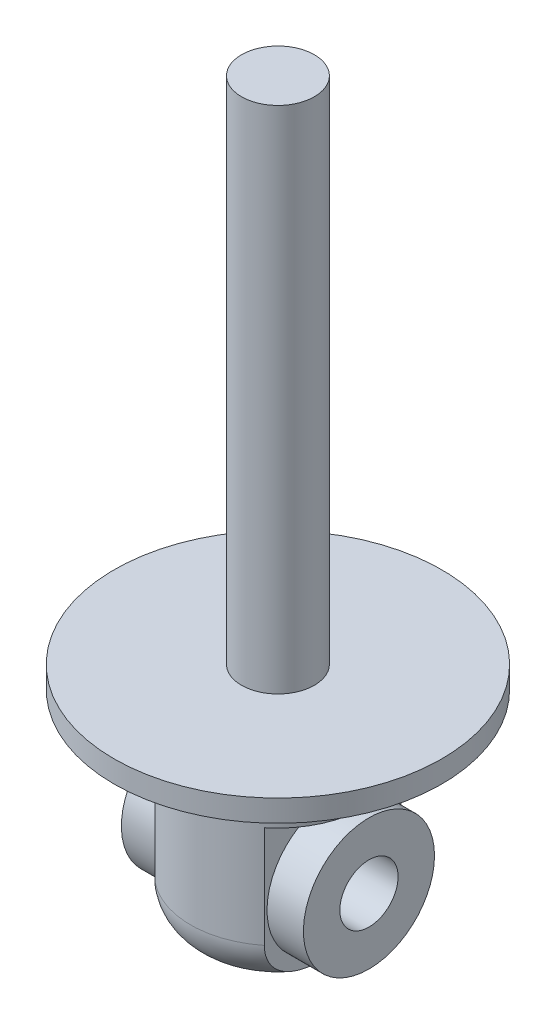
ISO-10303-21;
HEADER;
FILE_DESCRIPTION(('STEP AP214'),'2;1');
FILE_NAME('part.step','',(''),(''),'','','');
FILE_SCHEMA(('AUTOMOTIVE_DESIGN { 1 0 10303 214 1 1 1 1 }'));
ENDSEC;
DATA;
#1=APPLICATION_CONTEXT('core data for automotive mechanical design processes');
#2=APPLICATION_PROTOCOL_DEFINITION('international standard','automotive_design',2000,#1);
#3=PRODUCT_CONTEXT('',#1,'mechanical');
#4=PRODUCT('Part','Part','',(#3));
#5=PRODUCT_RELATED_PRODUCT_CATEGORY('part','',(#4));
#6=PRODUCT_DEFINITION_FORMATION('','',#4);
#7=PRODUCT_DEFINITION_CONTEXT('part definition',#1,'design');
#8=PRODUCT_DEFINITION('design','',#6,#7);
#9=PRODUCT_DEFINITION_SHAPE('','',#8);
#10=(LENGTH_UNIT() NAMED_UNIT(*) SI_UNIT(.MILLI.,.METRE.));
#11=(NAMED_UNIT(*) PLANE_ANGLE_UNIT() SI_UNIT($,.RADIAN.));
#12=(NAMED_UNIT(*) SI_UNIT($,.STERADIAN.) SOLID_ANGLE_UNIT());
#13=UNCERTAINTY_MEASURE_WITH_UNIT(LENGTH_MEASURE(1.E-05),#10,'distance_accuracy_value','');
#14=(GEOMETRIC_REPRESENTATION_CONTEXT(3) GLOBAL_UNCERTAINTY_ASSIGNED_CONTEXT((#13)) GLOBAL_UNIT_ASSIGNED_CONTEXT((#10,
#11,#12)) REPRESENTATION_CONTEXT('',''));
#15=CARTESIAN_POINT('',(0.,0.,0.));
#16=DIRECTION('',(0.,0.,1.));
#17=DIRECTION('',(1.,0.,0.));
#18=AXIS2_PLACEMENT_3D('',#15,#16,#17);
#19=CARTESIAN_POINT('',(-7.5,-8.,-22.5));
#20=DIRECTION('',(1.,0.,0.));
#21=DIRECTION('',(0.,1.,0.));
#22=AXIS2_PLACEMENT_3D('',#19,#20,#21);
#23=PLANE('',#22);
#24=CARTESIAN_POINT('',(-7.5,-27.8094750193111,0.));
#25=CARTESIAN_POINT('',(-7.5,-27.8094752958151,0.184521628242419));
#26=CARTESIAN_POINT('',(-7.5,-27.8077270322999,0.369043480287191));
#27=CARTESIAN_POINT('',(-7.5,-27.8006130628877,0.737999394292284));
#28=CARTESIAN_POINT('',(-7.5,-27.7952477367066,0.922433463434384));
#29=CARTESIAN_POINT('',(-7.5,-27.780538513706,1.29122559425462));
#30=CARTESIAN_POINT('',(-7.5,-27.7711929215574,1.47558358999919));
#31=CARTESIAN_POINT('',(-7.5,-27.7479507640883,1.84401846668315));
#32=CARTESIAN_POINT('',(-7.5,-27.734054140347,2.02809534398339));
#33=CARTESIAN_POINT('',(-7.5,-27.701027325669,2.39498843631837));
#34=CARTESIAN_POINT('',(-7.5,-27.6819201299087,2.57780665418326));
#35=CARTESIAN_POINT('',(-7.5,-27.6375682217561,2.94269408038083));
#36=CARTESIAN_POINT('',(-7.5,-27.6123230495969,3.12476323156505));
#37=CARTESIAN_POINT('',(-7.5,-27.5259360262262,3.6691632505479));
#38=CARTESIAN_POINT('',(-7.5,-27.4541196223952,4.02997739530099));
#39=CARTESIAN_POINT('',(-7.5,-27.315114172541,4.57935988961709));
#40=CARTESIAN_POINT('',(-7.5,-27.2608348848703,4.77122256452969));
#41=CARTESIAN_POINT('',(-7.5,-27.1402411036094,5.15109529504942));
#42=CARTESIAN_POINT('',(-7.5,-27.0739312594077,5.33910680786539));
#43=CARTESIAN_POINT('',(-7.5,-26.928148698992,5.70992505463463));
#44=CARTESIAN_POINT('',(-7.5,-26.8486797977089,5.8927332791208));
#45=CARTESIAN_POINT('',(-7.5,-26.6756224712841,6.25155879665883));
#46=CARTESIAN_POINT('',(-7.5,-26.5820364486502,6.42757723883459));
#47=CARTESIAN_POINT('',(-7.5,-26.3958384208508,6.74413785402998));
#48=CARTESIAN_POINT('',(-7.5,-26.3053527427416,6.8859302136676));
#49=CARTESIAN_POINT('',(-7.5,-26.1136422044668,7.16205254122039));
#50=CARTESIAN_POINT('',(-7.5,-26.0124194056704,7.29638393401336));
#51=CARTESIAN_POINT('',(-7.5,-25.7991822855038,7.55627452274061));
#52=CARTESIAN_POINT('',(-7.5,-25.6871652583255,7.6818315054992));
#53=CARTESIAN_POINT('',(-7.5,-25.4525813942248,7.92270374400352));
#54=CARTESIAN_POINT('',(-7.5,-25.3300144777409,8.03801892249803));
#55=CARTESIAN_POINT('',(-7.5,-25.0736714823962,8.25792234562975));
#56=CARTESIAN_POINT('',(-7.5,-24.9398051473305,8.36240569865935));
#57=CARTESIAN_POINT('',(-7.5,-24.662616920615,8.55796576900282));
#58=CARTESIAN_POINT('',(-7.5,-24.5192963548439,8.64904436046083));
#59=CARTESIAN_POINT('',(-7.5,-24.2243409104845,8.81636481076627));
#60=CARTESIAN_POINT('',(-7.5,-24.0727112205184,8.89261579636784));
#61=CARTESIAN_POINT('',(-7.5,-23.7624095052739,9.02909243430965));
#62=CARTESIAN_POINT('',(-7.5,-23.6037388369551,9.08932115899453));
#63=CARTESIAN_POINT('',(-7.5,-23.3052245459151,9.1849514334904));
#64=CARTESIAN_POINT('',(-7.5,-23.1661361294911,9.22272405795734));
#65=CARTESIAN_POINT('',(-7.5,-22.8851087613884,9.28547940350164));
#66=CARTESIAN_POINT('',(-7.5,-22.7431701638949,9.31046370365637));
#67=CARTESIAN_POINT('',(-7.5,-22.4576599589478,9.34730641699016));
#68=CARTESIAN_POINT('',(-7.5,-22.3140890586128,9.35917031033292));
#69=CARTESIAN_POINT('',(-7.5,-22.0264648581988,9.36963164548865));
#70=CARTESIAN_POINT('',(-7.5,-21.8824115750842,9.36822954903948));
#71=CARTESIAN_POINT('',(-7.5,-21.6061914815275,9.35280339576898));
#72=CARTESIAN_POINT('',(-7.5,-21.4739684759154,9.33976569953801));
#73=CARTESIAN_POINT('',(-7.5,-21.2110534946456,9.30256363878721));
#74=CARTESIAN_POINT('',(-7.5,-21.0803620180608,9.27839574533066));
#75=CARTESIAN_POINT('',(-7.5,-20.8215410609612,9.21922065645586));
#76=CARTESIAN_POINT('',(-7.5,-20.6934101253726,9.18421981495561));
#77=CARTESIAN_POINT('',(-7.5,-20.4404340442512,9.10374552536161));
#78=CARTESIAN_POINT('',(-7.5,-20.3155901493276,9.05826815366643));
#79=CARTESIAN_POINT('',(-7.5,-20.0692031015505,8.95699564520569));
#80=CARTESIAN_POINT('',(-7.5,-19.9476868658852,8.90113499399755));
#81=CARTESIAN_POINT('',(-7.5,-19.7094920695403,8.77987692751896));
#82=CARTESIAN_POINT('',(-7.5,-19.5928152563103,8.71447610526943));
#83=CARTESIAN_POINT('',(-7.5,-19.2509911073174,8.50489875856372));
#84=CARTESIAN_POINT('',(-7.5,-19.0339195251877,8.34729299116935));
#85=CARTESIAN_POINT('',(-7.5,-18.609337427954,7.98870608163153));
#86=CARTESIAN_POINT('',(-7.5,-18.4039002281567,7.78529755950602));
#87=CARTESIAN_POINT('',(-7.5,-18.0246758733926,7.35109040646743));
#88=CARTESIAN_POINT('',(-7.5,-17.8508837047537,7.12029612399675));
#89=CARTESIAN_POINT('',(-7.5,-17.5744409595824,6.69864287979116));
#90=CARTESIAN_POINT('',(-7.5,-17.4648689537028,6.51223410047274));
#91=CARTESIAN_POINT('',(-7.5,-17.2626904112623,6.13034538679087));
#92=CARTESIAN_POINT('',(-7.5,-17.1700919878543,5.93486117014359));
#93=CARTESIAN_POINT('',(-7.5,-17.0006313082269,5.53658641063458));
#94=CARTESIAN_POINT('',(-7.5,-16.9238147555949,5.33377659321381));
#95=CARTESIAN_POINT('',(-7.5,-16.784875362625,4.92331428460811));
#96=CARTESIAN_POINT('',(-7.5,-16.7227484430634,4.71566315546475));
#97=CARTESIAN_POINT('',(-7.5,-16.5386673542946,4.02250667384636));
#98=CARTESIAN_POINT('',(-7.5,-16.4449803111871,3.52942656369883));
#99=CARTESIAN_POINT('',(-7.5,-16.3412352530644,2.78498720051468));
#100=CARTESIAN_POINT('',(-7.5,-16.3127705467372,2.53568557770052));
#101=CARTESIAN_POINT('',(-7.5,-16.2658269581612,2.03612434937441));
#102=CARTESIAN_POINT('',(-7.5,-16.2473468655649,1.78586486368144));
#103=CARTESIAN_POINT('',(-7.5,-16.2184283009414,1.28363112408655));
#104=CARTESIAN_POINT('',(-7.5,-16.208031590786,1.03165466176094));
#105=CARTESIAN_POINT('',(-7.5,-16.1941849220444,0.527501194688707));
#106=CARTESIAN_POINT('',(-7.5,-16.1907352988047,0.27532418084894));
#107=CARTESIAN_POINT('',(-7.5,-16.1903333462322,-0.228731345602945));
#108=CARTESIAN_POINT('',(-7.5,-16.193373232494,-0.480609853630143));
#109=CARTESIAN_POINT('',(-7.5,-16.2063332691715,-0.984173581494234));
#110=CARTESIAN_POINT('',(-7.5,-16.2162528039696,-1.2358588166087));
#111=CARTESIAN_POINT('',(-7.5,-16.2454935008677,-1.7627882566893));
#112=CARTESIAN_POINT('',(-7.5,-16.2656211327378,-2.03798990109168));
#113=CARTESIAN_POINT('',(-7.5,-16.3180418431017,-2.58731345976836));
#114=CARTESIAN_POINT('',(-7.5,-16.3503365349836,-2.86143522597441));
#115=CARTESIAN_POINT('',(-7.5,-16.4300545548583,-3.40623279358435));
#116=CARTESIAN_POINT('',(-7.5,-16.4774071358833,-3.67691867401872));
#117=CARTESIAN_POINT('',(-7.5,-16.5907053400646,-4.2143947607995));
#118=CARTESIAN_POINT('',(-7.5,-16.6566449229111,-4.4811862031647));
#119=CARTESIAN_POINT('',(-7.5,-16.7911834026755,-4.94217748017442));
#120=CARTESIAN_POINT('',(-7.5,-16.8549558474619,-5.13778160857807));
#121=CARTESIAN_POINT('',(-7.5,-16.9961265709521,-5.52399422741739));
#122=CARTESIAN_POINT('',(-7.5,-17.0735207892669,-5.71460418712136));
#123=CARTESIAN_POINT('',(-7.5,-17.2430793617625,-6.08921987221889));
#124=CARTESIAN_POINT('',(-7.5,-17.3352463319138,-6.27322442084438));
#125=CARTESIAN_POINT('',(-7.5,-17.5351759469553,-6.63256976145457));
#126=CARTESIAN_POINT('',(-7.5,-17.6429345063483,-6.80791280693597));
#127=CARTESIAN_POINT('',(-7.5,-17.8487615005736,-7.10989658300673));
#128=CARTESIAN_POINT('',(-7.5,-17.9436617626469,-7.23870103997639));
#129=CARTESIAN_POINT('',(-7.5,-18.143229826346,-7.48856622066219));
#130=CARTESIAN_POINT('',(-7.5,-18.2478987883735,-7.60962602152204));
#131=CARTESIAN_POINT('',(-7.5,-18.4668045949393,-7.84271387792474));
#132=CARTESIAN_POINT('',(-7.5,-18.5810384459287,-7.95474473789612));
#133=CARTESIAN_POINT('',(-7.5,-18.8187268203134,-8.16854933672494));
#134=CARTESIAN_POINT('',(-7.5,-18.9421800591116,-8.27032449994957));
#135=CARTESIAN_POINT('',(-7.5,-19.1987356397018,-8.46313596223061));
#136=CARTESIAN_POINT('',(-7.5,-19.3319055781875,-8.55408255407202));
#137=CARTESIAN_POINT('',(-7.5,-19.6061418402457,-8.72304401015934));
#138=CARTESIAN_POINT('',(-7.5,-19.747204378254,-8.80106500403696));
#139=CARTESIAN_POINT('',(-7.5,-20.0362068877473,-8.94309470867639));
#140=CARTESIAN_POINT('',(-7.5,-20.1841460034049,-9.00710515749598));
#141=CARTESIAN_POINT('',(-7.5,-20.4856380297523,-9.12014361193693));
#142=CARTESIAN_POINT('',(-7.5,-20.6391901444676,-9.16917373274798));
#143=CARTESIAN_POINT('',(-7.5,-20.9313639562727,-9.24643392787081));
#144=CARTESIAN_POINT('',(-7.5,-21.0695088202567,-9.2764768563288));
#145=CARTESIAN_POINT('',(-7.5,-21.3479315795213,-9.32406143536891));
#146=CARTESIAN_POINT('',(-7.5,-21.4882092809527,-9.34160421520928));
#147=CARTESIAN_POINT('',(-7.5,-21.769719609589,-9.36396002322678));
#148=CARTESIAN_POINT('',(-7.5,-21.9109518422674,-9.36877802253041));
#149=CARTESIAN_POINT('',(-7.5,-22.1932734390957,-9.36563613906261));
#150=CARTESIAN_POINT('',(-7.5,-22.3343628067459,-9.35767657732182));
#151=CARTESIAN_POINT('',(-7.5,-22.6064011749062,-9.32998563551062));
#152=CARTESIAN_POINT('',(-7.5,-22.7374295539783,-9.31102660205279));
#153=CARTESIAN_POINT('',(-7.5,-22.9974780227225,-9.26218788836622));
#154=CARTESIAN_POINT('',(-7.5,-23.1264974548056,-9.23230470755187));
#155=CARTESIAN_POINT('',(-7.5,-23.3815508516768,-9.16196479385525));
#156=CARTESIAN_POINT('',(-7.5,-23.5075862018084,-9.12151307666088));
#157=CARTESIAN_POINT('',(-7.5,-23.7559772755244,-9.03044888037393));
#158=CARTESIAN_POINT('',(-7.5,-23.8783315975104,-8.97983258590814));
#159=CARTESIAN_POINT('',(-7.5,-24.1205569584555,-8.8680617574251));
#160=CARTESIAN_POINT('',(-7.5,-24.2403549182387,-8.80674877020291));
#161=CARTESIAN_POINT('',(-7.5,-24.4747211723639,-8.67480187441993));
#162=CARTESIAN_POINT('',(-7.5,-24.5892875713423,-8.60416462323317));
#163=CARTESIAN_POINT('',(-7.5,-24.9242270275788,-8.37928997825773));
#164=CARTESIAN_POINT('',(-7.5,-25.13600210755,-8.21201407264852));
#165=CARTESIAN_POINT('',(-7.5,-25.5504485361803,-7.832942739178));
#166=CARTESIAN_POINT('',(-7.5,-25.7507010772538,-7.618532285847));
#167=CARTESIAN_POINT('',(-7.5,-26.1185076671662,-7.16337882817299));
#168=CARTESIAN_POINT('',(-7.5,-26.2860513710234,-6.9226275303298));
#169=CARTESIAN_POINT('',(-7.5,-26.5545024709803,-6.4788664395953));
#170=CARTESIAN_POINT('',(-7.5,-26.6619013252763,-6.279707295078));
#171=CARTESIAN_POINT('',(-7.5,-26.858559219587,-5.87254463104013));
#172=CARTESIAN_POINT('',(-7.5,-26.9478095430477,-5.66453691936402));
#173=CARTESIAN_POINT('',(-7.5,-27.1096214973705,-5.24180758530233));
#174=CARTESIAN_POINT('',(-7.5,-27.1821555960046,-5.02707553901332));
#175=CARTESIAN_POINT('',(-7.5,-27.3121001369762,-4.59305326757356));
#176=CARTESIAN_POINT('',(-7.5,-27.3695048137837,-4.37376133898657));
#177=CARTESIAN_POINT('',(-7.5,-27.4981886749365,-3.81417726059937));
#178=CARTESIAN_POINT('',(-7.5,-27.5604951716191,-3.47183296905169));
#179=CARTESIAN_POINT('',(-7.5,-27.6609019684328,-2.78359200614869));
#180=CARTESIAN_POINT('',(-7.5,-27.6989863972919,-2.43769315620305));
#181=CARTESIAN_POINT('',(-7.5,-27.7425563308733,-1.91723181279188));
#182=CARTESIAN_POINT('',(-7.5,-27.7548291128016,-1.74318957751326));
#183=CARTESIAN_POINT('',(-7.5,-27.7753986995787,-1.39487161182967));
#184=CARTESIAN_POINT('',(-7.5,-27.7836956019396,-1.22059588725638));
#185=CARTESIAN_POINT('',(-7.5,-27.796777523185,-0.87196539298604));
#186=CARTESIAN_POINT('',(-7.5,-27.8015635129394,-0.697610658492171));
#187=CARTESIAN_POINT('',(-7.5,-27.8079121855994,-0.348837350643893));
#188=CARTESIAN_POINT('',(-7.5,-27.8094747579462,-0.174418775305038));
#189=CARTESIAN_POINT('',(-7.5,-27.8094750193111,0.));
#190=B_SPLINE_CURVE_WITH_KNOTS('',3,(#24,#25,#26,#27,#28,#29,#30,#31,#32,#33,#34,#35,#36,#37,
#38,#39,#40,#41,#42,#43,#44,#45,#46,#47,#48,#49,#50,#51,#52,#53,#54,#55,#56,#57,#58,#59,#60,#61,
#62,#63,#64,#65,#66,#67,#68,#69,#70,#71,#72,#73,#74,#75,#76,#77,#78,#79,#80,#81,#82,#83,#84,#85,
#86,#87,#88,#89,#90,#91,#92,#93,#94,#95,#96,#97,#98,#99,#100,#101,#102,#103,#104,#105,#106,#107,
#108,#109,#110,#111,#112,#113,#114,#115,#116,#117,#118,#119,#120,#121,#122,#123,#124,#125,#126,
#127,#128,#129,#130,#131,#132,#133,#134,#135,#136,#137,#138,#139,#140,#141,#142,#143,#144,#145,
#146,#147,#148,#149,#150,#151,#152,#153,#154,#155,#156,#157,#158,#159,#160,#161,#162,#163,#164,
#165,#166,#167,#168,#169,#170,#171,#172,#173,#174,#175,#176,#177,#178,#179,#180,#181,#182,#183,
#184,#185,#186,#187,#188,#189),.UNSPECIFIED.,.T.,.F.,(4,2,2,2,2,2,2,2,2,2,2,2,2,2,2,2,2,2,2,2,2,
2,2,2,2,2,2,2,2,2,2,2,2,2,2,2,2,2,2,2,2,2,2,2,2,2,2,2,2,2,2,2,2,2,2,2,2,2,2,2,2,2,2,2,2,2,2,2,2,
2,2,2,2,2,2,2,2,2,2,2,2,2,4),(0.,0.553556541747908,1.10705498067111,1.6607894093517,
2.21453094651203,2.76586720349669,3.31724477121585,4.41912680182766,5.01698525599297,
5.61461314908642,6.21206808675634,6.80942146164093,7.31357153503217,7.81762499361292,
8.32180513447661,8.82598907791493,9.33467160980088,9.84328295415676,10.3515802378956,
10.8597799828438,11.291588037567,11.7233427606026,12.1549170790764,12.5864763761706,
12.9845986570771,13.3828472534997,13.7808627038906,14.1790274594521,14.579795450788,
14.9807069160888,15.7821103743006,16.6461503316802,17.5100532757815,18.1578732554314,
18.8060020817716,19.4559821948788,20.1057815998326,21.6069748462105,22.3596793389022,
23.1122925673175,23.8687687149109,24.6252813779039,25.3808870860738,26.1364251884592,
26.9640249034877,27.7917343993232,28.6156111127982,29.4392203950451,30.0559954213971,
30.6725869093732,31.2892877047367,31.9058271963482,32.3853559200308,32.8649416785199,
33.3443778968313,33.823747436381,34.3068464150843,34.7897156366604,35.2725249226045,
35.7552660053908,36.1788379642465,36.6023716529343,37.0257398573389,37.4490974249689,
37.8458122806135,38.2426543730445,38.639308470493,39.0361117351622,39.4393886143668,
39.8428104576492,40.6491243408277,41.5260051520067,42.403162850804,43.0810551134699,
43.7592721958252,44.4385984678268,45.1181832448309,46.1608437011148,47.2041866484774,
47.7275747628343,48.2509500399341,48.7741805338585,49.2974289735857),.UNSPECIFIED.);
#191=CARTESIAN_POINT('',(-7.5,-22.,-9.3674969975976));
#192=VERTEX_POINT('',#191);
#193=CARTESIAN_POINT('',(-7.5,-21.9999999999999,9.36749699759766));
#194=VERTEX_POINT('',#193);
#195=EDGE_CURVE('E128',#192,#194,#190,.T.);
#196=ORIENTED_EDGE('',*,*,#195,.T.);
#197=DIRECTION('',(0.,1.,0.));
#198=VECTOR('',#197,1.);
#199=CARTESIAN_POINT('',(-7.49999999999999,-28.,9.3674969975976));
#200=LINE('',#199,#198);
#201=CARTESIAN_POINT('',(-7.5,-8.,9.36749699759759));
#202=VERTEX_POINT('',#201);
#203=EDGE_CURVE('E91',#202,#194,#200,.F.);
#204=ORIENTED_EDGE('',*,*,#203,.F.);
#205=DIRECTION('',(0.,0.,1.));
#206=VECTOR('',#205,1.);
#207=CARTESIAN_POINT('',(-7.5,-8.,-22.5));
#208=LINE('',#207,#206);
#209=CARTESIAN_POINT('',(-7.5,-8.,-9.36749699759761));
#210=VERTEX_POINT('',#209);
#211=EDGE_CURVE('E84',#210,#202,#208,.T.);
#212=ORIENTED_EDGE('',*,*,#211,.F.);
#213=DIRECTION('',(0.,1.,0.));
#214=VECTOR('',#213,1.);
#215=CARTESIAN_POINT('',(-7.49999999999999,-28.,-9.3674969975976));
#216=LINE('',#215,#214);
#217=EDGE_CURVE('E62',#192,#210,#216,.T.);
#218=ORIENTED_EDGE('',*,*,#217,.F.);
#219=EDGE_LOOP('',(#196,#204,#212,#218));
#220=FACE_BOUND('',#219,.T.);
#221=CARTESIAN_POINT('',(-7.5,-18.,0.));
#222=DIRECTION('',(1.,0.,0.));
#223=DIRECTION('',(0.,1.,0.));
#224=AXIS2_PLACEMENT_3D('',#221,#222,#223);
#225=CIRCLE('',#224,9.);
#226=CARTESIAN_POINT('',(-7.5,-9.,0.));
#227=VERTEX_POINT('',#226);
#228=EDGE_CURVE('E11',#227,#227,#225,.F.);
#229=ORIENTED_EDGE('',*,*,#228,.F.);
#230=EDGE_LOOP('',(#229));
#231=FACE_BOUND('',#230,.T.);
#232=ADVANCED_FACE('F37',(#220,#231),#23,.F.);
#233=CARTESIAN_POINT('',(7.5,-8.,-22.5));
#234=DIRECTION('',(-1.,0.,0.));
#235=DIRECTION('',(0.,-1.,0.));
#236=AXIS2_PLACEMENT_3D('',#233,#234,#235);
#237=PLANE('',#236);
#238=CARTESIAN_POINT('',(7.5,-27.8094750193111,0.));
#239=CARTESIAN_POINT('',(7.5,-27.8094752958151,-0.18452162824242));
#240=CARTESIAN_POINT('',(7.5,-27.8077270322999,-0.369043480287192));
#241=CARTESIAN_POINT('',(7.5,-27.8006130628877,-0.737999394292286));
#242=CARTESIAN_POINT('',(7.5,-27.7952477367066,-0.922433463434386));
#243=CARTESIAN_POINT('',(7.5,-27.780538513706,-1.29122559425462));
#244=CARTESIAN_POINT('',(7.5,-27.7711929215574,-1.47558358999919));
#245=CARTESIAN_POINT('',(7.5,-27.7479507640883,-1.84401846668315));
#246=CARTESIAN_POINT('',(7.5,-27.734054140347,-2.0280953439834));
#247=CARTESIAN_POINT('',(7.5,-27.701027325669,-2.39498843631837));
#248=CARTESIAN_POINT('',(7.5,-27.6819201299087,-2.57780665418327));
#249=CARTESIAN_POINT('',(7.5,-27.6375682217561,-2.94269408038084));
#250=CARTESIAN_POINT('',(7.5,-27.6123230495969,-3.12476323156505));
#251=CARTESIAN_POINT('',(7.5,-27.5259360262262,-3.6691632505479));
#252=CARTESIAN_POINT('',(7.5,-27.4541196223952,-4.029977395301));
#253=CARTESIAN_POINT('',(7.5,-27.315114172541,-4.57935988961709));
#254=CARTESIAN_POINT('',(7.5,-27.2608348848703,-4.7712225645297));
#255=CARTESIAN_POINT('',(7.5,-27.1402411036094,-5.15109529504943));
#256=CARTESIAN_POINT('',(7.5,-27.0739312594077,-5.3391068078654));
#257=CARTESIAN_POINT('',(7.5,-26.9281486989919,-5.70992505463464));
#258=CARTESIAN_POINT('',(7.5,-26.8486797977089,-5.8927332791208));
#259=CARTESIAN_POINT('',(7.5,-26.6756224712841,-6.25155879665883));
#260=CARTESIAN_POINT('',(7.5,-26.5820364486501,-6.4275772388346));
#261=CARTESIAN_POINT('',(7.5,-26.3958384208508,-6.74413785402998));
#262=CARTESIAN_POINT('',(7.5,-26.3053527427416,-6.8859302136676));
#263=CARTESIAN_POINT('',(7.5,-26.1136422044668,-7.16205254122039));
#264=CARTESIAN_POINT('',(7.5,-26.0124194056704,-7.29638393401336));
#265=CARTESIAN_POINT('',(7.5,-25.7991822855038,-7.55627452274061));
#266=CARTESIAN_POINT('',(7.5,-25.6871652583255,-7.6818315054992));
#267=CARTESIAN_POINT('',(7.5,-25.4525813942248,-7.92270374400352));
#268=CARTESIAN_POINT('',(7.5,-25.3300144777409,-8.03801892249802));
#269=CARTESIAN_POINT('',(7.5,-25.0736714823962,-8.25792234562975));
#270=CARTESIAN_POINT('',(7.5,-24.9398051473305,-8.36240569865935));
#271=CARTESIAN_POINT('',(7.5,-24.662616920615,-8.55796576900281));
#272=CARTESIAN_POINT('',(7.5,-24.5192963548439,-8.64904436046082));
#273=CARTESIAN_POINT('',(7.5,-24.2243409104845,-8.81636481076626));
#274=CARTESIAN_POINT('',(7.5,-24.0727112205184,-8.89261579636783));
#275=CARTESIAN_POINT('',(7.5,-23.7624095052739,-9.02909243430965));
#276=CARTESIAN_POINT('',(7.5,-23.6037388369551,-9.08932115899453));
#277=CARTESIAN_POINT('',(7.5,-23.3052245459151,-9.1849514334904));
#278=CARTESIAN_POINT('',(7.5,-23.1661361294911,-9.22272405795733));
#279=CARTESIAN_POINT('',(7.5,-22.8851087613884,-9.28547940350163));
#280=CARTESIAN_POINT('',(7.5,-22.7431701638949,-9.31046370365637));
#281=CARTESIAN_POINT('',(7.5,-22.4576599589478,-9.34730641699015));
#282=CARTESIAN_POINT('',(7.5,-22.3140890586128,-9.35917031033292));
#283=CARTESIAN_POINT('',(7.5,-22.0264648581988,-9.36963164548865));
#284=CARTESIAN_POINT('',(7.5,-21.8824115750842,-9.36822954903947));
#285=CARTESIAN_POINT('',(7.5,-21.6061914815275,-9.35280339576898));
#286=CARTESIAN_POINT('',(7.5,-21.4739684759153,-9.33976569953801));
#287=CARTESIAN_POINT('',(7.5,-21.2110534946456,-9.3025636387872));
#288=CARTESIAN_POINT('',(7.5,-21.0803620180608,-9.27839574533065));
#289=CARTESIAN_POINT('',(7.5,-20.8215410609612,-9.21922065645586));
#290=CARTESIAN_POINT('',(7.5,-20.6934101253726,-9.1842198149556));
#291=CARTESIAN_POINT('',(7.5,-20.4404340442512,-9.1037455253616));
#292=CARTESIAN_POINT('',(7.5,-20.3155901493276,-9.05826815366643));
#293=CARTESIAN_POINT('',(7.5,-20.0692031015505,-8.95699564520569));
#294=CARTESIAN_POINT('',(7.5,-19.9476868658852,-8.90113499399755));
#295=CARTESIAN_POINT('',(7.5,-19.7094920695403,-8.77987692751896));
#296=CARTESIAN_POINT('',(7.5,-19.5928152563103,-8.71447610526943));
#297=CARTESIAN_POINT('',(7.5,-19.2509911073174,-8.50489875856371));
#298=CARTESIAN_POINT('',(7.5,-19.0339195251877,-8.34729299116934));
#299=CARTESIAN_POINT('',(7.5,-18.609337427954,-7.98870608163152));
#300=CARTESIAN_POINT('',(7.5,-18.4039002281567,-7.78529755950601));
#301=CARTESIAN_POINT('',(7.5,-18.0246758733926,-7.35109040646742));
#302=CARTESIAN_POINT('',(7.5,-17.8508837047537,-7.12029612399674));
#303=CARTESIAN_POINT('',(7.5,-17.5744409595824,-6.69864287979115));
#304=CARTESIAN_POINT('',(7.5,-17.4648689537028,-6.51223410047273));
#305=CARTESIAN_POINT('',(7.5,-17.2626904112623,-6.13034538679086));
#306=CARTESIAN_POINT('',(7.5,-17.1700919878543,-5.93486117014358));
#307=CARTESIAN_POINT('',(7.5,-17.0006313082269,-5.53658641063457));
#308=CARTESIAN_POINT('',(7.5,-16.9238147555949,-5.3337765932138));
#309=CARTESIAN_POINT('',(7.5,-16.784875362625,-4.9233142846081));
#310=CARTESIAN_POINT('',(7.5,-16.7227484430634,-4.71566315546474));
#311=CARTESIAN_POINT('',(7.5,-16.5386673542946,-4.02250667384636));
#312=CARTESIAN_POINT('',(7.5,-16.4449803111871,-3.52942656369882));
#313=CARTESIAN_POINT('',(7.5,-16.3412352530644,-2.78498720051467));
#314=CARTESIAN_POINT('',(7.5,-16.3127705467372,-2.53568557770051));
#315=CARTESIAN_POINT('',(7.5,-16.2658269581612,-2.0361243493744));
#316=CARTESIAN_POINT('',(7.5,-16.2473468655649,-1.78586486368143));
#317=CARTESIAN_POINT('',(7.5,-16.2184283009414,-1.28363112408654));
#318=CARTESIAN_POINT('',(7.5,-16.208031590786,-1.03165466176093));
#319=CARTESIAN_POINT('',(7.5,-16.1941849220444,-0.5275011946887));
#320=CARTESIAN_POINT('',(7.5,-16.1907352988047,-0.275324180848932));
#321=CARTESIAN_POINT('',(7.5,-16.1903333462322,0.228731345602954));
#322=CARTESIAN_POINT('',(7.5,-16.193373232494,0.480609853630152));
#323=CARTESIAN_POINT('',(7.5,-16.2063332691715,0.984173581494243));
#324=CARTESIAN_POINT('',(7.5,-16.2162528039696,1.23585881660871));
#325=CARTESIAN_POINT('',(7.5,-16.2454935008677,1.76278825668931));
#326=CARTESIAN_POINT('',(7.5,-16.2656211327378,2.03798990109169));
#327=CARTESIAN_POINT('',(7.5,-16.3180418431017,2.58731345976837));
#328=CARTESIAN_POINT('',(7.5,-16.3503365349836,2.86143522597442));
#329=CARTESIAN_POINT('',(7.5,-16.4300545548583,3.40623279358436));
#330=CARTESIAN_POINT('',(7.5,-16.4774071358833,3.67691867401872));
#331=CARTESIAN_POINT('',(7.5,-16.5907053400646,4.21439476079951));
#332=CARTESIAN_POINT('',(7.5,-16.6566449229111,4.48118620316469));
#333=CARTESIAN_POINT('',(7.5,-16.7911834026755,4.94217748017442));
#334=CARTESIAN_POINT('',(7.5,-16.8549558474619,5.13778160857806));
#335=CARTESIAN_POINT('',(7.5,-16.9961265709521,5.52399422741739));
#336=CARTESIAN_POINT('',(7.5,-17.0735207892669,5.71460418712136));
#337=CARTESIAN_POINT('',(7.5,-17.2430793617625,6.08921987221889));
#338=CARTESIAN_POINT('',(7.5,-17.3352463319138,6.27322442084438));
#339=CARTESIAN_POINT('',(7.5,-17.5351759469553,6.63256976145456));
#340=CARTESIAN_POINT('',(7.5,-17.6429345063483,6.80791280693597));
#341=CARTESIAN_POINT('',(7.5,-17.8487615005736,7.10989658300674));
#342=CARTESIAN_POINT('',(7.5,-17.9436617626469,7.23870103997639));
#343=CARTESIAN_POINT('',(7.5,-18.143229826346,7.48856622066219));
#344=CARTESIAN_POINT('',(7.5,-18.2478987883735,7.60962602152205));
#345=CARTESIAN_POINT('',(7.5,-18.4668045949393,7.84271387792474));
#346=CARTESIAN_POINT('',(7.5,-18.5810384459287,7.95474473789612));
#347=CARTESIAN_POINT('',(7.5,-18.8187268203134,8.16854933672494));
#348=CARTESIAN_POINT('',(7.5,-18.9421800591116,8.27032449994956));
#349=CARTESIAN_POINT('',(7.5,-19.1987356397018,8.46313596223061));
#350=CARTESIAN_POINT('',(7.5,-19.3319055781875,8.55408255407202));
#351=CARTESIAN_POINT('',(7.5,-19.6061418402457,8.72304401015933));
#352=CARTESIAN_POINT('',(7.5,-19.747204378254,8.80106500403696));
#353=CARTESIAN_POINT('',(7.5,-20.0362068877473,8.94309470867638));
#354=CARTESIAN_POINT('',(7.5,-20.1841460034049,9.00710515749598));
#355=CARTESIAN_POINT('',(7.5,-20.4856380297523,9.12014361193692));
#356=CARTESIAN_POINT('',(7.5,-20.6391901444676,9.16917373274798));
#357=CARTESIAN_POINT('',(7.5,-20.9313639562727,9.24643392787081));
#358=CARTESIAN_POINT('',(7.5,-21.0695088202567,9.27647685632879));
#359=CARTESIAN_POINT('',(7.5,-21.3479315795213,9.32406143536891));
#360=CARTESIAN_POINT('',(7.5,-21.4882092809527,9.34160421520928));
#361=CARTESIAN_POINT('',(7.5,-21.769719609589,9.36396002322678));
#362=CARTESIAN_POINT('',(7.5,-21.9109518422674,9.36877802253041));
#363=CARTESIAN_POINT('',(7.5,-22.1932734390957,9.36563613906261));
#364=CARTESIAN_POINT('',(7.5,-22.3343628067459,9.35767657732182));
#365=CARTESIAN_POINT('',(7.5,-22.6064011749062,9.32998563551062));
#366=CARTESIAN_POINT('',(7.5,-22.7374295539783,9.31102660205278));
#367=CARTESIAN_POINT('',(7.5,-22.9974780227225,9.26218788836621));
#368=CARTESIAN_POINT('',(7.5,-23.1264974548056,9.23230470755187));
#369=CARTESIAN_POINT('',(7.5,-23.3815508516768,9.16196479385525));
#370=CARTESIAN_POINT('',(7.5,-23.5075862018084,9.12151307666088));
#371=CARTESIAN_POINT('',(7.5,-23.7559772755244,9.03044888037392));
#372=CARTESIAN_POINT('',(7.5,-23.8783315975104,8.97983258590813));
#373=CARTESIAN_POINT('',(7.5,-24.1205569584555,8.86806175742509));
#374=CARTESIAN_POINT('',(7.5,-24.2403549182387,8.8067487702029));
#375=CARTESIAN_POINT('',(7.5,-24.4747211723639,8.67480187441993));
#376=CARTESIAN_POINT('',(7.5,-24.5892875713423,8.60416462323317));
#377=CARTESIAN_POINT('',(7.5,-24.9242270275788,8.37928997825773));
#378=CARTESIAN_POINT('',(7.5,-25.13600210755,8.21201407264852));
#379=CARTESIAN_POINT('',(7.5,-25.5504485361803,7.832942739178));
#380=CARTESIAN_POINT('',(7.5,-25.7507010772538,7.61853228584699));
#381=CARTESIAN_POINT('',(7.5,-26.1185076671662,7.16337882817298));
#382=CARTESIAN_POINT('',(7.5,-26.2860513710234,6.92262753032979));
#383=CARTESIAN_POINT('',(7.5,-26.5545024709803,6.4788664395953));
#384=CARTESIAN_POINT('',(7.5,-26.6619013252763,6.27970729507799));
#385=CARTESIAN_POINT('',(7.5,-26.858559219587,5.87254463104012));
#386=CARTESIAN_POINT('',(7.5,-26.9478095430477,5.66453691936401));
#387=CARTESIAN_POINT('',(7.5,-27.1096214973705,5.24180758530232));
#388=CARTESIAN_POINT('',(7.5,-27.1821555960046,5.02707553901331));
#389=CARTESIAN_POINT('',(7.5,-27.3121001369762,4.59305326757356));
#390=CARTESIAN_POINT('',(7.5,-27.3695048137837,4.37376133898656));
#391=CARTESIAN_POINT('',(7.5,-27.4981886749365,3.81417726059937));
#392=CARTESIAN_POINT('',(7.5,-27.5604951716191,3.47183296905169));
#393=CARTESIAN_POINT('',(7.5,-27.6609019684328,2.78359200614869));
#394=CARTESIAN_POINT('',(7.5,-27.6989863972919,2.43769315620305));
#395=CARTESIAN_POINT('',(7.5,-27.7425563308733,1.91723181279187));
#396=CARTESIAN_POINT('',(7.5,-27.7548291128016,1.74318957751326));
#397=CARTESIAN_POINT('',(7.5,-27.7753986995787,1.39487161182967));
#398=CARTESIAN_POINT('',(7.5,-27.7836956019396,1.22059588725638));
#399=CARTESIAN_POINT('',(7.5,-27.796777523185,0.871965392986041));
#400=CARTESIAN_POINT('',(7.5,-27.8015635129394,0.697610658492171));
#401=CARTESIAN_POINT('',(7.5,-27.8079121855994,0.348837350643893));
#402=CARTESIAN_POINT('',(7.5,-27.8094747579462,0.174418775305038));
#403=CARTESIAN_POINT('',(7.5,-27.8094750193111,0.));
#404=B_SPLINE_CURVE_WITH_KNOTS('',3,(#238,#239,#240,#241,#242,#243,#244,#245,#246,#247,#248,
#249,#250,#251,#252,#253,#254,#255,#256,#257,#258,#259,#260,#261,#262,#263,#264,#265,#266,#267,
#268,#269,#270,#271,#272,#273,#274,#275,#276,#277,#278,#279,#280,#281,#282,#283,#284,#285,#286,
#287,#288,#289,#290,#291,#292,#293,#294,#295,#296,#297,#298,#299,#300,#301,#302,#303,#304,#305,
#306,#307,#308,#309,#310,#311,#312,#313,#314,#315,#316,#317,#318,#319,#320,#321,#322,#323,#324,
#325,#326,#327,#328,#329,#330,#331,#332,#333,#334,#335,#336,#337,#338,#339,#340,#341,#342,#343,
#344,#345,#346,#347,#348,#349,#350,#351,#352,#353,#354,#355,#356,#357,#358,#359,#360,#361,#362,
#363,#364,#365,#366,#367,#368,#369,#370,#371,#372,#373,#374,#375,#376,#377,#378,#379,#380,#381,
#382,#383,#384,#385,#386,#387,#388,#389,#390,#391,#392,#393,#394,#395,#396,#397,#398,#399,#400,
#401,#402,#403),.UNSPECIFIED.,.T.,.F.,(4,2,2,2,2,2,2,2,2,2,2,2,2,2,2,2,2,2,2,2,2,2,2,2,2,2,2,2,
2,2,2,2,2,2,2,2,2,2,2,2,2,2,2,2,2,2,2,2,2,2,2,2,2,2,2,2,2,2,2,2,2,2,2,2,2,2,2,2,2,2,2,2,2,2,2,2,
2,2,2,2,2,2,4),(0.,0.553556541747909,1.10705498067111,1.66078940935171,2.21453094651203,
2.7658672034967,3.31724477121586,4.41912680182767,5.01698525599298,5.61461314908643,
6.21206808675635,6.80942146164093,7.31357153503217,7.81762499361292,8.32180513447662,
8.82598907791493,9.33467160980088,9.84328295415676,10.3515802378956,10.8597799828438,
11.291588037567,11.7233427606026,12.1549170790764,12.5864763761706,12.9845986570771,
13.3828472534997,13.7808627038906,14.1790274594521,14.579795450788,14.9807069160888,
15.7821103743006,16.6461503316802,17.5100532757815,18.1578732554314,18.8060020817716,
19.4559821948789,20.1057815998326,21.6069748462105,22.3596793389022,23.1122925673176,
23.8687687149109,24.6252813779039,25.3808870860738,26.1364251884592,26.9640249034878,
27.7917343993232,28.6156111127982,29.4392203950451,30.0559954213971,30.6725869093732,
31.2892877047367,31.9058271963482,32.3853559200308,32.8649416785199,33.3443778968313,
33.823747436381,34.3068464150843,34.7897156366603,35.2725249226045,35.7552660053908,
36.1788379642464,36.6023716529342,37.0257398573389,37.4490974249688,37.8458122806135,
38.2426543730445,38.6393084704929,39.0361117351622,39.4393886143667,39.8428104576491,
40.6491243408276,41.5260051520067,42.4031628508039,43.0810551134699,43.7592721958252,
44.4385984678267,45.1181832448308,46.1608437011148,47.2041866484774,47.7275747628343,
48.2509500399341,48.7741805338585,49.2974289735857),.UNSPECIFIED.);
#405=CARTESIAN_POINT('',(7.5,-22.,9.3674969975976));
#406=VERTEX_POINT('',#405);
#407=CARTESIAN_POINT('',(7.5,-21.9999999999999,-9.36749699759765));
#408=VERTEX_POINT('',#407);
#409=EDGE_CURVE('E88',#406,#408,#404,.T.);
#410=ORIENTED_EDGE('',*,*,#409,.T.);
#411=DIRECTION('',(0.,1.,0.));
#412=VECTOR('',#411,1.);
#413=CARTESIAN_POINT('',(7.5,-28.,-9.3674969975976));
#414=LINE('',#413,#412);
#415=CARTESIAN_POINT('',(7.5,-8.,-9.3674969975976));
#416=VERTEX_POINT('',#415);
#417=EDGE_CURVE('E102',#416,#408,#414,.F.);
#418=ORIENTED_EDGE('',*,*,#417,.F.);
#419=DIRECTION('',(0.,0.,1.));
#420=VECTOR('',#419,1.);
#421=CARTESIAN_POINT('',(7.5,-8.,-22.5));
#422=LINE('',#421,#420);
#423=CARTESIAN_POINT('',(7.5,-8.,9.3674969975976));
#424=VERTEX_POINT('',#423);
#425=EDGE_CURVE('E92',#416,#424,#422,.T.);
#426=ORIENTED_EDGE('',*,*,#425,.T.);
#427=DIRECTION('',(0.,1.,0.));
#428=VECTOR('',#427,1.);
#429=CARTESIAN_POINT('',(7.5,-28.,9.3674969975976));
#430=LINE('',#429,#428);
#431=EDGE_CURVE('E54',#406,#424,#430,.T.);
#432=ORIENTED_EDGE('',*,*,#431,.F.);
#433=EDGE_LOOP('',(#410,#418,#426,#432));
#434=FACE_BOUND('',#433,.T.);
#435=CARTESIAN_POINT('',(7.5,-18.,0.));
#436=DIRECTION('',(-1.,0.,0.));
#437=DIRECTION('',(0.,-1.,0.));
#438=AXIS2_PLACEMENT_3D('',#435,#436,#437);
#439=CIRCLE('',#438,9.);
#440=CARTESIAN_POINT('',(7.5,-27.,0.));
#441=VERTEX_POINT('',#440);
#442=EDGE_CURVE('E42',#441,#441,#439,.F.);
#443=ORIENTED_EDGE('',*,*,#442,.F.);
#444=EDGE_LOOP('',(#443));
#445=FACE_BOUND('',#444,.T.);
#446=ADVANCED_FACE('F142',(#434,#445),#237,.F.);
#447=CARTESIAN_POINT('',(0.,3.,0.));
#448=DIRECTION('',(0.,-1.,0.));
#449=DIRECTION('',(0.,0.,-1.));
#450=AXIS2_PLACEMENT_3D('',#447,#448,#449);
#451=CYLINDRICAL_SURFACE('',#450,22.5);
#452=CARTESIAN_POINT('',(0.,3.,0.));
#453=DIRECTION('',(0.,1.,0.));
#454=DIRECTION('',(0.,0.,1.));
#455=AXIS2_PLACEMENT_3D('',#452,#453,#454);
#456=CIRCLE('',#455,22.5);
#457=CARTESIAN_POINT('',(0.,3.,22.5));
#458=VERTEX_POINT('',#457);
#459=EDGE_CURVE('E119',#458,#458,#456,.T.);
#460=ORIENTED_EDGE('',*,*,#459,.F.);
#461=EDGE_LOOP('',(#460));
#462=FACE_BOUND('',#461,.T.);
#463=CARTESIAN_POINT('',(0.,0.,0.));
#464=DIRECTION('',(0.,1.,0.));
#465=DIRECTION('',(0.,0.,1.));
#466=AXIS2_PLACEMENT_3D('',#463,#464,#465);
#467=CIRCLE('',#466,22.5);
#468=CARTESIAN_POINT('',(0.,0.,22.5));
#469=VERTEX_POINT('',#468);
#470=EDGE_CURVE('E116',#469,#469,#467,.T.);
#471=ORIENTED_EDGE('',*,*,#470,.T.);
#472=EDGE_LOOP('',(#471));
#473=FACE_BOUND('',#472,.T.);
#474=ADVANCED_FACE('F164',(#462,#473),#451,.T.);
#475=CARTESIAN_POINT('',(0.,3.,0.));
#476=DIRECTION('',(0.,1.,0.));
#477=DIRECTION('',(0.,0.,1.));
#478=AXIS2_PLACEMENT_3D('',#475,#476,#477);
#479=PLANE('',#478);
#480=CARTESIAN_POINT('',(0.,3.,0.));
#481=DIRECTION('',(0.,1.,0.));
#482=DIRECTION('',(0.,0.,1.));
#483=AXIS2_PLACEMENT_3D('',#480,#481,#482);
#484=CIRCLE('',#483,5.);
#485=CARTESIAN_POINT('',(0.,3.,5.));
#486=VERTEX_POINT('',#485);
#487=EDGE_CURVE('E113',#486,#486,#484,.T.);
#488=ORIENTED_EDGE('',*,*,#487,.F.);
#489=EDGE_LOOP('',(#488));
#490=FACE_BOUND('',#489,.T.);
#491=ORIENTED_EDGE('',*,*,#459,.T.);
#492=EDGE_LOOP('',(#491));
#493=FACE_BOUND('',#492,.T.);
#494=ADVANCED_FACE('F161',(#490,#493),#479,.T.);
#495=CARTESIAN_POINT('',(0.,0.,0.));
#496=DIRECTION('',(0.,1.,0.));
#497=DIRECTION('',(0.,0.,1.));
#498=AXIS2_PLACEMENT_3D('',#495,#496,#497);
#499=PLANE('',#498);
#500=CARTESIAN_POINT('',(0.,0.,0.));
#501=DIRECTION('',(0.,-1.,0.));
#502=DIRECTION('',(0.,0.,-1.));
#503=AXIS2_PLACEMENT_3D('',#500,#501,#502);
#504=CIRCLE('',#503,12.);
#505=CARTESIAN_POINT('',(0.,0.,-12.));
#506=VERTEX_POINT('',#505);
#507=EDGE_CURVE('E109',#506,#506,#504,.T.);
#508=ORIENTED_EDGE('',*,*,#507,.F.);
#509=EDGE_LOOP('',(#508));
#510=FACE_BOUND('',#509,.T.);
#511=ORIENTED_EDGE('',*,*,#470,.F.);
#512=EDGE_LOOP('',(#511));
#513=FACE_BOUND('',#512,.T.);
#514=ADVANCED_FACE('F159',(#510,#513),#499,.F.);
#515=CARTESIAN_POINT('',(0.,73.,0.));
#516=DIRECTION('',(0.,-1.,0.));
#517=DIRECTION('',(0.,0.,-1.));
#518=AXIS2_PLACEMENT_3D('',#515,#516,#517);
#519=CYLINDRICAL_SURFACE('',#518,5.);
#520=CARTESIAN_POINT('',(0.,73.,0.));
#521=DIRECTION('',(0.,1.,0.));
#522=DIRECTION('',(0.,0.,1.));
#523=AXIS2_PLACEMENT_3D('',#520,#521,#522);
#524=CIRCLE('',#523,5.);
#525=CARTESIAN_POINT('',(0.,73.,5.));
#526=VERTEX_POINT('',#525);
#527=EDGE_CURVE('E108',#526,#526,#524,.T.);
#528=ORIENTED_EDGE('',*,*,#527,.F.);
#529=EDGE_LOOP('',(#528));
#530=FACE_BOUND('',#529,.T.);
#531=ORIENTED_EDGE('',*,*,#487,.T.);
#532=EDGE_LOOP('',(#531));
#533=FACE_BOUND('',#532,.T.);
#534=ADVANCED_FACE('F155',(#530,#533),#519,.T.);
#535=CARTESIAN_POINT('',(0.,73.,0.));
#536=DIRECTION('',(0.,1.,0.));
#537=DIRECTION('',(0.,0.,1.));
#538=AXIS2_PLACEMENT_3D('',#535,#536,#537);
#539=PLANE('',#538);
#540=ORIENTED_EDGE('',*,*,#527,.T.);
#541=EDGE_LOOP('',(#540));
#542=FACE_BOUND('',#541,.T.);
#543=ADVANCED_FACE('F152',(#542),#539,.T.);
#544=CARTESIAN_POINT('',(0.,-28.,0.));
#545=DIRECTION('',(0.,1.,0.));
#546=DIRECTION('',(0.,0.,1.));
#547=AXIS2_PLACEMENT_3D('',#544,#545,#546);
#548=CYLINDRICAL_SURFACE('',#547,12.);
#549=CARTESIAN_POINT('',(0.,-22.,0.));
#550=DIRECTION('',(0.,-1.,0.));
#551=DIRECTION('',(0.,0.,-1.));
#552=AXIS2_PLACEMENT_3D('',#549,#550,#551);
#553=CIRCLE('',#552,12.);
#554=EDGE_CURVE('E127',#194,#406,#553,.F.);
#555=ORIENTED_EDGE('',*,*,#554,.T.);
#556=ORIENTED_EDGE('',*,*,#431,.T.);
#557=CARTESIAN_POINT('',(0.,-8.,0.));
#558=DIRECTION('',(0.,1.,0.));
#559=DIRECTION('',(-1.,0.,0.));
#560=AXIS2_PLACEMENT_3D('',#557,#558,#559);
#561=CIRCLE('',#560,12.);
#562=EDGE_CURVE('E87',#424,#416,#561,.T.);
#563=ORIENTED_EDGE('',*,*,#562,.T.);
#564=ORIENTED_EDGE('',*,*,#417,.T.);
#565=EDGE_CURVE('E101',#408,#192,#553,.F.);
#566=ORIENTED_EDGE('',*,*,#565,.T.);
#567=ORIENTED_EDGE('',*,*,#217,.T.);
#568=CARTESIAN_POINT('',(0.,-8.,0.));
#569=DIRECTION('',(0.,1.,0.));
#570=DIRECTION('',(-1.,0.,0.));
#571=AXIS2_PLACEMENT_3D('',#568,#569,#570);
#572=CIRCLE('',#571,12.);
#573=EDGE_CURVE('E82',#210,#202,#572,.T.);
#574=ORIENTED_EDGE('',*,*,#573,.T.);
#575=ORIENTED_EDGE('',*,*,#203,.T.);
#576=EDGE_LOOP('',(#555,#556,#563,#564,#566,#567,#574,#575));
#577=FACE_BOUND('',#576,.T.);
#578=ORIENTED_EDGE('',*,*,#507,.T.);
#579=EDGE_LOOP('',(#578));
#580=FACE_BOUND('',#579,.T.);
#581=ADVANCED_FACE('F97',(#577,#580),#548,.T.);
#582=CARTESIAN_POINT('',(0.,-28.,0.));
#583=DIRECTION('',(0.,-1.,0.));
#584=DIRECTION('',(0.,0.,-1.));
#585=AXIS2_PLACEMENT_3D('',#582,#583,#584);
#586=PLANE('',#585);
#587=CARTESIAN_POINT('',(0.,-28.,0.));
#588=DIRECTION('',(0.,-1.,0.));
#589=DIRECTION('',(0.,0.,-1.));
#590=AXIS2_PLACEMENT_3D('',#587,#588,#589);
#591=CIRCLE('',#590,6.);
#592=CARTESIAN_POINT('',(0.,-28.,-6.));
#593=VERTEX_POINT('',#592);
#594=EDGE_CURVE('E112',#593,#593,#591,.T.);
#595=ORIENTED_EDGE('',*,*,#594,.T.);
#596=EDGE_LOOP('',(#595));
#597=FACE_BOUND('',#596,.T.);
#598=ADVANCED_FACE('F146',(#597),#586,.T.);
#599=CARTESIAN_POINT('',(0.,-22.,0.));
#600=DIRECTION('',(0.,-1.,0.));
#601=DIRECTION('',(0.,0.,-1.));
#602=AXIS2_PLACEMENT_3D('',#599,#600,#601);
#603=TOROIDAL_SURFACE('',#602,6.,6.);
#604=ORIENTED_EDGE('',*,*,#409,.F.);
#605=ORIENTED_EDGE('',*,*,#554,.F.);
#606=ORIENTED_EDGE('',*,*,#195,.F.);
#607=ORIENTED_EDGE('',*,*,#565,.F.);
#608=EDGE_LOOP('',(#604,#605,#606,#607));
#609=FACE_BOUND('',#608,.T.);
#610=ORIENTED_EDGE('',*,*,#594,.F.);
#611=EDGE_LOOP('',(#610));
#612=FACE_BOUND('',#611,.T.);
#613=ADVANCED_FACE('F39',(#609,#612),#603,.T.);
#614=CARTESIAN_POINT('',(-27.07,-8.00000000000001,-22.5));
#615=DIRECTION('',(0.,1.,0.));
#616=DIRECTION('',(-1.,0.,0.));
#617=AXIS2_PLACEMENT_3D('',#614,#615,#616);
#618=PLANE('',#617);
#619=ORIENTED_EDGE('',*,*,#211,.T.);
#620=ORIENTED_EDGE('',*,*,#573,.F.);
#621=EDGE_LOOP('',(#619,#620));
#622=FACE_BOUND('',#621,.T.);
#623=ADVANCED_FACE('F83',(#622),#618,.F.);
#624=CARTESIAN_POINT('',(27.07,-8.,-22.5));
#625=DIRECTION('',(0.,1.,0.));
#626=DIRECTION('',(-1.,0.,0.));
#627=AXIS2_PLACEMENT_3D('',#624,#625,#626);
#628=PLANE('',#627);
#629=ORIENTED_EDGE('',*,*,#425,.F.);
#630=ORIENTED_EDGE('',*,*,#562,.F.);
#631=EDGE_LOOP('',(#629,#630));
#632=FACE_BOUND('',#631,.T.);
#633=ADVANCED_FACE('F143',(#632),#628,.F.);
#634=CARTESIAN_POINT('',(12.5,-18.,0.));
#635=DIRECTION('',(-1.,0.,0.));
#636=DIRECTION('',(0.,0.,1.));
#637=AXIS2_PLACEMENT_3D('',#634,#635,#636);
#638=CYLINDRICAL_SURFACE('',#637,9.);
#639=CARTESIAN_POINT('',(12.5,-18.,0.));
#640=DIRECTION('',(1.,0.,0.));
#641=DIRECTION('',(0.,0.,-1.));
#642=AXIS2_PLACEMENT_3D('',#639,#640,#641);
#643=CIRCLE('',#642,9.);
#644=CARTESIAN_POINT('',(12.5,-18.,-9.));
#645=VERTEX_POINT('',#644);
#646=EDGE_CURVE('E93',#645,#645,#643,.T.);
#647=ORIENTED_EDGE('',*,*,#646,.F.);
#648=EDGE_LOOP('',(#647));
#649=FACE_BOUND('',#648,.T.);
#650=ORIENTED_EDGE('',*,*,#442,.T.);
#651=EDGE_LOOP('',(#650));
#652=FACE_BOUND('',#651,.T.);
#653=ADVANCED_FACE('F193',(#649,#652),#638,.T.);
#654=CARTESIAN_POINT('',(12.5,-18.,0.));
#655=DIRECTION('',(1.,0.,0.));
#656=DIRECTION('',(0.,0.,-1.));
#657=AXIS2_PLACEMENT_3D('',#654,#655,#656);
#658=PLANE('',#657);
#659=ORIENTED_EDGE('',*,*,#646,.T.);
#660=EDGE_LOOP('',(#659));
#661=FACE_BOUND('',#660,.T.);
#662=CARTESIAN_POINT('',(12.5,-18.,0.));
#663=DIRECTION('',(1.,0.,0.));
#664=DIRECTION('',(0.,0.,-1.));
#665=AXIS2_PLACEMENT_3D('',#662,#663,#664);
#666=CIRCLE('',#665,4.);
#667=CARTESIAN_POINT('',(12.5,-18.,-4.));
#668=VERTEX_POINT('',#667);
#669=EDGE_CURVE('E208',#668,#668,#666,.T.);
#670=ORIENTED_EDGE('',*,*,#669,.F.);
#671=EDGE_LOOP('',(#670));
#672=FACE_BOUND('',#671,.T.);
#673=ADVANCED_FACE('F191',(#661,#672),#658,.T.);
#674=CARTESIAN_POINT('',(-12.5,-18.,0.));
#675=DIRECTION('',(1.,0.,0.));
#676=DIRECTION('',(0.,0.,-1.));
#677=AXIS2_PLACEMENT_3D('',#674,#675,#676);
#678=CIRCLE('',#677,9.);
#679=CARTESIAN_POINT('',(-12.5,-18.,-9.));
#680=VERTEX_POINT('',#679);
#681=EDGE_CURVE('E209',#680,#680,#678,.T.);
#682=ORIENTED_EDGE('',*,*,#681,.T.);
#683=EDGE_LOOP('',(#682));
#684=FACE_BOUND('',#683,.T.);
#685=ORIENTED_EDGE('',*,*,#228,.T.);
#686=EDGE_LOOP('',(#685));
#687=FACE_BOUND('',#686,.T.);
#688=ADVANCED_FACE('F188',(#684,#687),#638,.T.);
#689=CARTESIAN_POINT('',(-12.5,-18.,0.));
#690=DIRECTION('',(1.,0.,0.));
#691=DIRECTION('',(0.,0.,-1.));
#692=AXIS2_PLACEMENT_3D('',#689,#690,#691);
#693=PLANE('',#692);
#694=ORIENTED_EDGE('',*,*,#681,.F.);
#695=EDGE_LOOP('',(#694));
#696=FACE_BOUND('',#695,.T.);
#697=CARTESIAN_POINT('',(-12.5,-18.,0.));
#698=DIRECTION('',(1.,0.,0.));
#699=DIRECTION('',(0.,0.,-1.));
#700=AXIS2_PLACEMENT_3D('',#697,#698,#699);
#701=CIRCLE('',#700,4.);
#702=CARTESIAN_POINT('',(-12.5,-18.,-4.));
#703=VERTEX_POINT('',#702);
#704=EDGE_CURVE('E210',#703,#703,#701,.T.);
#705=ORIENTED_EDGE('',*,*,#704,.T.);
#706=EDGE_LOOP('',(#705));
#707=FACE_BOUND('',#706,.T.);
#708=ADVANCED_FACE('F186',(#696,#707),#693,.F.);
#709=CARTESIAN_POINT('',(-20.5,-18.,0.));
#710=DIRECTION('',(1.,0.,0.));
#711=DIRECTION('',(0.,1.,0.));
#712=AXIS2_PLACEMENT_3D('',#709,#710,#711);
#713=CYLINDRICAL_SURFACE('',#712,4.);
#714=ORIENTED_EDGE('',*,*,#669,.T.);
#715=EDGE_LOOP('',(#714));
#716=FACE_BOUND('',#715,.T.);
#717=ORIENTED_EDGE('',*,*,#704,.F.);
#718=EDGE_LOOP('',(#717));
#719=FACE_BOUND('',#718,.T.);
#720=ADVANCED_FACE('F183',(#716,#719),#713,.F.);
#721=CLOSED_SHELL('',(#232,#446,#474,#494,#514,#534,#543,#581,#598,#613,#623,#633,#653,#673,
#688,#708,#720));
#722=MANIFOLD_SOLID_BREP('B2',#721);
#723=ADVANCED_BREP_SHAPE_REPRESENTATION('',(#18,#722),#14);
#724=SHAPE_DEFINITION_REPRESENTATION(#9,#723);
ENDSEC;
END-ISO-10303-21;
